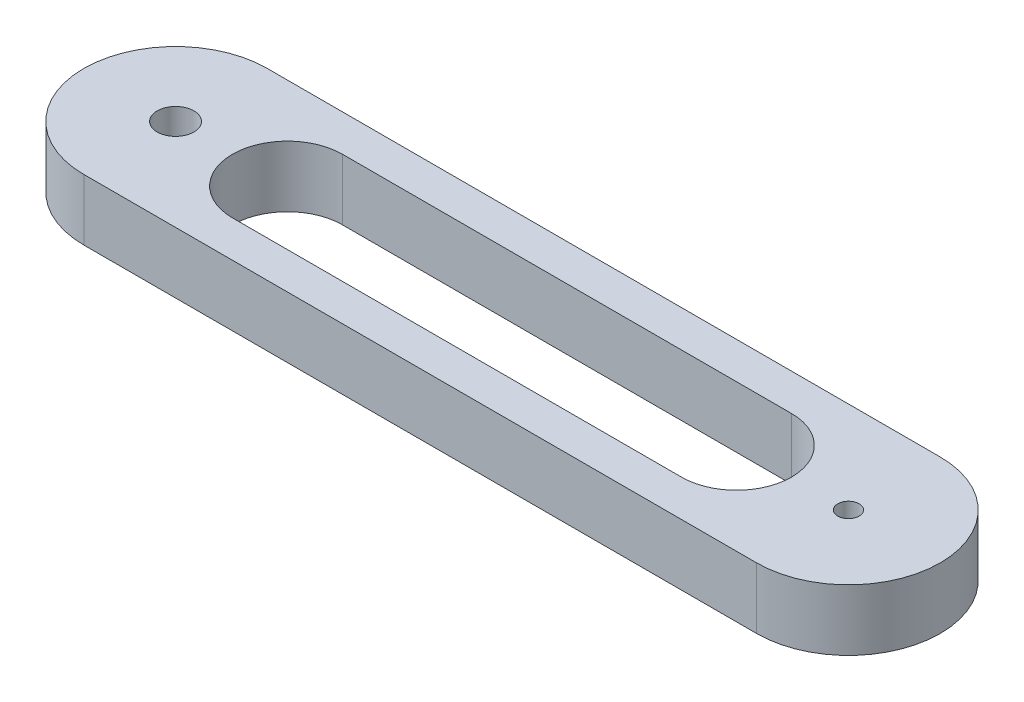
ISO-10303-21;
HEADER;
FILE_DESCRIPTION(('STEP AP214'),'2;1');
FILE_NAME('part.step','',(''),(''),'','','');
FILE_SCHEMA(('AUTOMOTIVE_DESIGN { 1 0 10303 214 1 1 1 1 }'));
ENDSEC;
DATA;
#1=APPLICATION_CONTEXT('core data for automotive mechanical design processes');
#2=APPLICATION_PROTOCOL_DEFINITION('international standard','automotive_design',2000,#1);
#3=PRODUCT_CONTEXT('',#1,'mechanical');
#4=PRODUCT('Part','Part','',(#3));
#5=PRODUCT_RELATED_PRODUCT_CATEGORY('part','',(#4));
#6=PRODUCT_DEFINITION_FORMATION('','',#4);
#7=PRODUCT_DEFINITION_CONTEXT('part definition',#1,'design');
#8=PRODUCT_DEFINITION('design','',#6,#7);
#9=PRODUCT_DEFINITION_SHAPE('','',#8);
#10=(LENGTH_UNIT() NAMED_UNIT(*) SI_UNIT(.MILLI.,.METRE.));
#11=(NAMED_UNIT(*) PLANE_ANGLE_UNIT() SI_UNIT($,.RADIAN.));
#12=(NAMED_UNIT(*) SI_UNIT($,.STERADIAN.) SOLID_ANGLE_UNIT());
#13=UNCERTAINTY_MEASURE_WITH_UNIT(LENGTH_MEASURE(1.E-05),#10,'distance_accuracy_value','');
#14=(GEOMETRIC_REPRESENTATION_CONTEXT(3) GLOBAL_UNCERTAINTY_ASSIGNED_CONTEXT((#13)) GLOBAL_UNIT_ASSIGNED_CONTEXT((#10,
#11,#12)) REPRESENTATION_CONTEXT('',''));
#15=CARTESIAN_POINT('',(0.,0.,0.));
#16=DIRECTION('',(0.,0.,1.));
#17=DIRECTION('',(1.,0.,0.));
#18=AXIS2_PLACEMENT_3D('',#15,#16,#17);
#19=CARTESIAN_POINT('',(0.,10.,0.));
#20=DIRECTION('',(0.,1.,0.));
#21=DIRECTION('',(0.,0.,1.));
#22=AXIS2_PLACEMENT_3D('',#19,#20,#21);
#23=PLANE('',#22);
#24=CARTESIAN_POINT('',(110.,10.,0.));
#25=DIRECTION('',(0.,1.,0.));
#26=DIRECTION('',(0.,0.,1.));
#27=AXIS2_PLACEMENT_3D('',#24,#25,#26);
#28=CIRCLE('',#27,1.75);
#29=CARTESIAN_POINT('',(110.,10.,1.75));
#30=VERTEX_POINT('',#29);
#31=EDGE_CURVE('E266',#30,#30,#28,.T.);
#32=ORIENTED_EDGE('',*,*,#31,.F.);
#33=EDGE_LOOP('',(#32));
#34=FACE_BOUND('',#33,.T.);
#35=CARTESIAN_POINT('',(0.,10.,0.));
#36=DIRECTION('',(0.,1.,0.));
#37=DIRECTION('',(0.,0.,1.));
#38=AXIS2_PLACEMENT_3D('',#35,#36,#37);
#39=CIRCLE('',#38,3.);
#40=CARTESIAN_POINT('',(0.,10.,3.));
#41=VERTEX_POINT('',#40);
#42=EDGE_CURVE('E132',#41,#41,#39,.T.);
#43=ORIENTED_EDGE('',*,*,#42,.F.);
#44=EDGE_LOOP('',(#43));
#45=FACE_BOUND('',#44,.T.);
#46=CARTESIAN_POINT('',(18.2957105742591,10.,0.));
#47=DIRECTION('',(0.,1.,0.));
#48=DIRECTION('',(0.,0.,1.));
#49=AXIS2_PLACEMENT_3D('',#46,#47,#48);
#50=CIRCLE('',#49,9.);
#51=CARTESIAN_POINT('',(18.2957105742591,10.,-9.));
#52=VERTEX_POINT('',#51);
#53=CARTESIAN_POINT('',(18.2957105742591,10.,9.));
#54=VERTEX_POINT('',#53);
#55=EDGE_CURVE('E54',#52,#54,#50,.T.);
#56=ORIENTED_EDGE('',*,*,#55,.F.);
#57=DIRECTION('',(-1.,0.,0.));
#58=VECTOR('',#57,1.);
#59=CARTESIAN_POINT('',(18.2957105742591,10.,-9.));
#60=LINE('',#59,#58);
#61=CARTESIAN_POINT('',(91.7,10.,-9.00000000000001));
#62=VERTEX_POINT('',#61);
#63=EDGE_CURVE('E125',#62,#52,#60,.T.);
#64=ORIENTED_EDGE('',*,*,#63,.F.);
#65=CARTESIAN_POINT('',(91.7,10.,0.));
#66=DIRECTION('',(0.,1.,0.));
#67=DIRECTION('',(0.,0.,1.));
#68=AXIS2_PLACEMENT_3D('',#65,#66,#67);
#69=CIRCLE('',#68,9.00000000000001);
#70=CARTESIAN_POINT('',(91.7,10.,9.00000000000001));
#71=VERTEX_POINT('',#70);
#72=EDGE_CURVE('E129',#71,#62,#69,.T.);
#73=ORIENTED_EDGE('',*,*,#72,.F.);
#74=DIRECTION('',(1.,0.,0.));
#75=VECTOR('',#74,1.);
#76=CARTESIAN_POINT('',(18.2957105742591,10.,9.));
#77=LINE('',#76,#75);
#78=EDGE_CURVE('E141',#54,#71,#77,.T.);
#79=ORIENTED_EDGE('',*,*,#78,.F.);
#80=EDGE_LOOP('',(#56,#64,#73,#79));
#81=FACE_BOUND('',#80,.T.);
#82=CARTESIAN_POINT('',(0.,10.,0.));
#83=DIRECTION('',(0.,1.,0.));
#84=DIRECTION('',(0.,0.,1.));
#85=AXIS2_PLACEMENT_3D('',#82,#83,#84);
#86=CIRCLE('',#85,15.);
#87=CARTESIAN_POINT('',(0.,10.,-15.));
#88=VERTEX_POINT('',#87);
#89=CARTESIAN_POINT('',(0.,10.,15.));
#90=VERTEX_POINT('',#89);
#91=EDGE_CURVE('E157',#88,#90,#86,.T.);
#92=ORIENTED_EDGE('',*,*,#91,.T.);
#93=DIRECTION('',(1.,0.,0.));
#94=VECTOR('',#93,1.);
#95=CARTESIAN_POINT('',(0.,10.,15.));
#96=LINE('',#95,#94);
#97=CARTESIAN_POINT('',(110.,10.,15.));
#98=VERTEX_POINT('',#97);
#99=EDGE_CURVE('E161',#90,#98,#96,.T.);
#100=ORIENTED_EDGE('',*,*,#99,.T.);
#101=CARTESIAN_POINT('',(110.,10.,0.));
#102=DIRECTION('',(0.,1.,0.));
#103=DIRECTION('',(0.,0.,1.));
#104=AXIS2_PLACEMENT_3D('',#101,#102,#103);
#105=CIRCLE('',#104,15.);
#106=CARTESIAN_POINT('',(110.,10.,-15.));
#107=VERTEX_POINT('',#106);
#108=EDGE_CURVE('E165',#98,#107,#105,.T.);
#109=ORIENTED_EDGE('',*,*,#108,.T.);
#110=DIRECTION('',(-1.,0.,0.));
#111=VECTOR('',#110,1.);
#112=CARTESIAN_POINT('',(0.,10.,-15.));
#113=LINE('',#112,#111);
#114=EDGE_CURVE('E168',#107,#88,#113,.T.);
#115=ORIENTED_EDGE('',*,*,#114,.T.);
#116=EDGE_LOOP('',(#92,#100,#109,#115));
#117=FACE_BOUND('',#116,.T.);
#118=ADVANCED_FACE('F38',(#34,#45,#81,#117),#23,.T.);
#119=CARTESIAN_POINT('',(0.,0.,0.));
#120=DIRECTION('',(0.,1.,0.));
#121=DIRECTION('',(0.,0.,1.));
#122=AXIS2_PLACEMENT_3D('',#119,#120,#121);
#123=PLANE('',#122);
#124=CARTESIAN_POINT('',(110.,0.,0.));
#125=DIRECTION('',(0.,1.,0.));
#126=DIRECTION('',(0.,0.,1.));
#127=AXIS2_PLACEMENT_3D('',#124,#125,#126);
#128=CIRCLE('',#127,1.75);
#129=CARTESIAN_POINT('',(110.,0.,1.75));
#130=VERTEX_POINT('',#129);
#131=EDGE_CURVE('E262',#130,#130,#128,.T.);
#132=ORIENTED_EDGE('',*,*,#131,.T.);
#133=EDGE_LOOP('',(#132));
#134=FACE_BOUND('',#133,.T.);
#135=CARTESIAN_POINT('',(0.,0.,0.));
#136=DIRECTION('',(0.,1.,0.));
#137=DIRECTION('',(0.,0.,1.));
#138=AXIS2_PLACEMENT_3D('',#135,#136,#137);
#139=CIRCLE('',#138,3.);
#140=CARTESIAN_POINT('',(0.,0.,3.));
#141=VERTEX_POINT('',#140);
#142=EDGE_CURVE('E142',#141,#141,#139,.T.);
#143=ORIENTED_EDGE('',*,*,#142,.T.);
#144=EDGE_LOOP('',(#143));
#145=FACE_BOUND('',#144,.T.);
#146=DIRECTION('',(-1.,0.,0.));
#147=VECTOR('',#146,1.);
#148=CARTESIAN_POINT('',(18.2957105742591,0.,-9.));
#149=LINE('',#148,#147);
#150=CARTESIAN_POINT('',(91.7,0.,-9.00000000000001));
#151=VERTEX_POINT('',#150);
#152=CARTESIAN_POINT('',(18.2957105742591,0.,-9.));
#153=VERTEX_POINT('',#152);
#154=EDGE_CURVE('E113',#151,#153,#149,.T.);
#155=ORIENTED_EDGE('',*,*,#154,.T.);
#156=CARTESIAN_POINT('',(18.2957105742591,0.,0.));
#157=DIRECTION('',(0.,1.,0.));
#158=DIRECTION('',(0.,0.,1.));
#159=AXIS2_PLACEMENT_3D('',#156,#157,#158);
#160=CIRCLE('',#159,9.);
#161=CARTESIAN_POINT('',(18.2957105742591,0.,9.));
#162=VERTEX_POINT('',#161);
#163=EDGE_CURVE('E106',#153,#162,#160,.T.);
#164=ORIENTED_EDGE('',*,*,#163,.T.);
#165=DIRECTION('',(1.,0.,0.));
#166=VECTOR('',#165,1.);
#167=CARTESIAN_POINT('',(18.2957105742591,0.,9.));
#168=LINE('',#167,#166);
#169=CARTESIAN_POINT('',(91.7,0.,9.00000000000001));
#170=VERTEX_POINT('',#169);
#171=EDGE_CURVE('E116',#162,#170,#168,.T.);
#172=ORIENTED_EDGE('',*,*,#171,.T.);
#173=CARTESIAN_POINT('',(91.7,0.,0.));
#174=DIRECTION('',(0.,1.,0.));
#175=DIRECTION('',(0.,0.,1.));
#176=AXIS2_PLACEMENT_3D('',#173,#174,#175);
#177=CIRCLE('',#176,9.00000000000001);
#178=EDGE_CURVE('E62',#170,#151,#177,.T.);
#179=ORIENTED_EDGE('',*,*,#178,.T.);
#180=EDGE_LOOP('',(#155,#164,#172,#179));
#181=FACE_BOUND('',#180,.T.);
#182=CARTESIAN_POINT('',(0.,0.,0.));
#183=DIRECTION('',(0.,1.,0.));
#184=DIRECTION('',(0.,0.,1.));
#185=AXIS2_PLACEMENT_3D('',#182,#183,#184);
#186=CIRCLE('',#185,15.);
#187=CARTESIAN_POINT('',(0.,0.,-15.));
#188=VERTEX_POINT('',#187);
#189=CARTESIAN_POINT('',(0.,0.,15.));
#190=VERTEX_POINT('',#189);
#191=EDGE_CURVE('E151',#188,#190,#186,.T.);
#192=ORIENTED_EDGE('',*,*,#191,.F.);
#193=DIRECTION('',(-1.,0.,0.));
#194=VECTOR('',#193,1.);
#195=CARTESIAN_POINT('',(0.,0.,-15.));
#196=LINE('',#195,#194);
#197=CARTESIAN_POINT('',(110.,0.,-15.));
#198=VERTEX_POINT('',#197);
#199=EDGE_CURVE('E162',#198,#188,#196,.T.);
#200=ORIENTED_EDGE('',*,*,#199,.F.);
#201=CARTESIAN_POINT('',(110.,0.,0.));
#202=DIRECTION('',(0.,1.,0.));
#203=DIRECTION('',(0.,0.,1.));
#204=AXIS2_PLACEMENT_3D('',#201,#202,#203);
#205=CIRCLE('',#204,15.);
#206=CARTESIAN_POINT('',(110.,0.,15.));
#207=VERTEX_POINT('',#206);
#208=EDGE_CURVE('E178',#207,#198,#205,.T.);
#209=ORIENTED_EDGE('',*,*,#208,.F.);
#210=DIRECTION('',(1.,0.,0.));
#211=VECTOR('',#210,1.);
#212=CARTESIAN_POINT('',(0.,0.,15.));
#213=LINE('',#212,#211);
#214=EDGE_CURVE('E175',#190,#207,#213,.T.);
#215=ORIENTED_EDGE('',*,*,#214,.F.);
#216=EDGE_LOOP('',(#192,#200,#209,#215));
#217=FACE_BOUND('',#216,.T.);
#218=ADVANCED_FACE('F121',(#134,#145,#181,#217),#123,.F.);
#219=CARTESIAN_POINT('',(0.,10.,0.));
#220=DIRECTION('',(0.,-1.,0.));
#221=DIRECTION('',(0.,0.,-1.));
#222=AXIS2_PLACEMENT_3D('',#219,#220,#221);
#223=CYLINDRICAL_SURFACE('',#222,15.);
#224=ORIENTED_EDGE('',*,*,#191,.T.);
#225=DIRECTION('',(0.,-1.,0.));
#226=VECTOR('',#225,1.);
#227=CARTESIAN_POINT('',(0.,10.,15.));
#228=LINE('',#227,#226);
#229=EDGE_CURVE('E11',#90,#190,#228,.T.);
#230=ORIENTED_EDGE('',*,*,#229,.F.);
#231=ORIENTED_EDGE('',*,*,#91,.F.);
#232=DIRECTION('',(0.,-1.,0.));
#233=VECTOR('',#232,1.);
#234=CARTESIAN_POINT('',(0.,10.,-15.));
#235=LINE('',#234,#233);
#236=EDGE_CURVE('E171',#88,#188,#235,.T.);
#237=ORIENTED_EDGE('',*,*,#236,.T.);
#238=EDGE_LOOP('',(#224,#230,#231,#237));
#239=FACE_BOUND('',#238,.T.);
#240=ADVANCED_FACE('F40',(#239),#223,.T.);
#241=CARTESIAN_POINT('',(0.,10.,15.));
#242=DIRECTION('',(0.,0.,-1.));
#243=DIRECTION('',(-1.,0.,0.));
#244=AXIS2_PLACEMENT_3D('',#241,#242,#243);
#245=PLANE('',#244);
#246=ORIENTED_EDGE('',*,*,#214,.T.);
#247=DIRECTION('',(0.,-1.,0.));
#248=VECTOR('',#247,1.);
#249=CARTESIAN_POINT('',(110.,10.,15.));
#250=LINE('',#249,#248);
#251=EDGE_CURVE('E47',#98,#207,#250,.T.);
#252=ORIENTED_EDGE('',*,*,#251,.F.);
#253=ORIENTED_EDGE('',*,*,#99,.F.);
#254=ORIENTED_EDGE('',*,*,#229,.T.);
#255=EDGE_LOOP('',(#246,#252,#253,#254));
#256=FACE_BOUND('',#255,.T.);
#257=ADVANCED_FACE('F208',(#256),#245,.F.);
#258=CARTESIAN_POINT('',(110.,10.,0.));
#259=DIRECTION('',(0.,-1.,0.));
#260=DIRECTION('',(0.,0.,-1.));
#261=AXIS2_PLACEMENT_3D('',#258,#259,#260);
#262=CYLINDRICAL_SURFACE('',#261,15.);
#263=ORIENTED_EDGE('',*,*,#208,.T.);
#264=DIRECTION('',(0.,-1.,0.));
#265=VECTOR('',#264,1.);
#266=CARTESIAN_POINT('',(110.,10.,-15.));
#267=LINE('',#266,#265);
#268=EDGE_CURVE('E186',#107,#198,#267,.T.);
#269=ORIENTED_EDGE('',*,*,#268,.F.);
#270=ORIENTED_EDGE('',*,*,#108,.F.);
#271=ORIENTED_EDGE('',*,*,#251,.T.);
#272=EDGE_LOOP('',(#263,#269,#270,#271));
#273=FACE_BOUND('',#272,.T.);
#274=ADVANCED_FACE('F195',(#273),#262,.T.);
#275=CARTESIAN_POINT('',(0.,10.,-15.));
#276=DIRECTION('',(0.,0.,1.));
#277=DIRECTION('',(1.,0.,0.));
#278=AXIS2_PLACEMENT_3D('',#275,#276,#277);
#279=PLANE('',#278);
#280=ORIENTED_EDGE('',*,*,#199,.T.);
#281=ORIENTED_EDGE('',*,*,#236,.F.);
#282=ORIENTED_EDGE('',*,*,#114,.F.);
#283=ORIENTED_EDGE('',*,*,#268,.T.);
#284=EDGE_LOOP('',(#280,#281,#282,#283));
#285=FACE_BOUND('',#284,.T.);
#286=ADVANCED_FACE('F202',(#285),#279,.F.);
#287=CARTESIAN_POINT('',(18.2957105742591,0.,0.));
#288=DIRECTION('',(0.,1.,0.));
#289=DIRECTION('',(0.,0.,1.));
#290=AXIS2_PLACEMENT_3D('',#287,#288,#289);
#291=CYLINDRICAL_SURFACE('',#290,9.);
#292=ORIENTED_EDGE('',*,*,#55,.T.);
#293=DIRECTION('',(0.,1.,0.));
#294=VECTOR('',#293,1.);
#295=CARTESIAN_POINT('',(18.2957105742591,0.,9.));
#296=LINE('',#295,#294);
#297=EDGE_CURVE('E102',#162,#54,#296,.T.);
#298=ORIENTED_EDGE('',*,*,#297,.F.);
#299=ORIENTED_EDGE('',*,*,#163,.F.);
#300=DIRECTION('',(0.,1.,0.));
#301=VECTOR('',#300,1.);
#302=CARTESIAN_POINT('',(18.2957105742591,0.,-9.));
#303=LINE('',#302,#301);
#304=EDGE_CURVE('E148',#153,#52,#303,.T.);
#305=ORIENTED_EDGE('',*,*,#304,.T.);
#306=EDGE_LOOP('',(#292,#298,#299,#305));
#307=FACE_BOUND('',#306,.T.);
#308=ADVANCED_FACE('F104',(#307),#291,.F.);
#309=CARTESIAN_POINT('',(18.2957105742591,0.,-9.));
#310=DIRECTION('',(0.,0.,-1.));
#311=DIRECTION('',(-1.,0.,0.));
#312=AXIS2_PLACEMENT_3D('',#309,#310,#311);
#313=PLANE('',#312);
#314=ORIENTED_EDGE('',*,*,#63,.T.);
#315=ORIENTED_EDGE('',*,*,#304,.F.);
#316=ORIENTED_EDGE('',*,*,#154,.F.);
#317=DIRECTION('',(0.,1.,0.));
#318=VECTOR('',#317,1.);
#319=CARTESIAN_POINT('',(91.7,0.,-9.00000000000001));
#320=LINE('',#319,#318);
#321=EDGE_CURVE('E152',#151,#62,#320,.T.);
#322=ORIENTED_EDGE('',*,*,#321,.T.);
#323=EDGE_LOOP('',(#314,#315,#316,#322));
#324=FACE_BOUND('',#323,.T.);
#325=ADVANCED_FACE('F233',(#324),#313,.F.);
#326=CARTESIAN_POINT('',(91.7,0.,0.));
#327=DIRECTION('',(0.,1.,0.));
#328=DIRECTION('',(0.,0.,1.));
#329=AXIS2_PLACEMENT_3D('',#326,#327,#328);
#330=CYLINDRICAL_SURFACE('',#329,9.00000000000001);
#331=ORIENTED_EDGE('',*,*,#72,.T.);
#332=ORIENTED_EDGE('',*,*,#321,.F.);
#333=ORIENTED_EDGE('',*,*,#178,.F.);
#334=DIRECTION('',(0.,1.,0.));
#335=VECTOR('',#334,1.);
#336=CARTESIAN_POINT('',(91.7,0.,9.00000000000001));
#337=LINE('',#336,#335);
#338=EDGE_CURVE('E112',#170,#71,#337,.T.);
#339=ORIENTED_EDGE('',*,*,#338,.T.);
#340=EDGE_LOOP('',(#331,#332,#333,#339));
#341=FACE_BOUND('',#340,.T.);
#342=ADVANCED_FACE('F237',(#341),#330,.F.);
#343=CARTESIAN_POINT('',(18.2957105742591,0.,9.));
#344=DIRECTION('',(0.,0.,1.));
#345=DIRECTION('',(1.,0.,0.));
#346=AXIS2_PLACEMENT_3D('',#343,#344,#345);
#347=PLANE('',#346);
#348=ORIENTED_EDGE('',*,*,#78,.T.);
#349=ORIENTED_EDGE('',*,*,#338,.F.);
#350=ORIENTED_EDGE('',*,*,#171,.F.);
#351=ORIENTED_EDGE('',*,*,#297,.T.);
#352=EDGE_LOOP('',(#348,#349,#350,#351));
#353=FACE_BOUND('',#352,.T.);
#354=ADVANCED_FACE('F117',(#353),#347,.F.);
#355=CARTESIAN_POINT('',(0.,0.,0.));
#356=DIRECTION('',(0.,1.,0.));
#357=DIRECTION('',(0.,0.,1.));
#358=AXIS2_PLACEMENT_3D('',#355,#356,#357);
#359=CYLINDRICAL_SURFACE('',#358,3.);
#360=ORIENTED_EDGE('',*,*,#142,.F.);
#361=EDGE_LOOP('',(#360));
#362=FACE_BOUND('',#361,.T.);
#363=ORIENTED_EDGE('',*,*,#42,.T.);
#364=EDGE_LOOP('',(#363));
#365=FACE_BOUND('',#364,.T.);
#366=ADVANCED_FACE('F245',(#362,#365),#359,.F.);
#367=CARTESIAN_POINT('',(110.,0.,0.));
#368=DIRECTION('',(0.,1.,0.));
#369=DIRECTION('',(0.,0.,1.));
#370=AXIS2_PLACEMENT_3D('',#367,#368,#369);
#371=CYLINDRICAL_SURFACE('',#370,1.75);
#372=ORIENTED_EDGE('',*,*,#131,.F.);
#373=EDGE_LOOP('',(#372));
#374=FACE_BOUND('',#373,.T.);
#375=ORIENTED_EDGE('',*,*,#31,.T.);
#376=EDGE_LOOP('',(#375));
#377=FACE_BOUND('',#376,.T.);
#378=ADVANCED_FACE('F251',(#374,#377),#371,.F.);
#379=CLOSED_SHELL('',(#118,#218,#240,#257,#274,#286,#308,#325,#342,#354,#366,#378));
#380=MANIFOLD_SOLID_BREP('B2',#379);
#381=ADVANCED_BREP_SHAPE_REPRESENTATION('',(#18,#380),#14);
#382=SHAPE_DEFINITION_REPRESENTATION(#9,#381);
ENDSEC;
END-ISO-10303-21;
